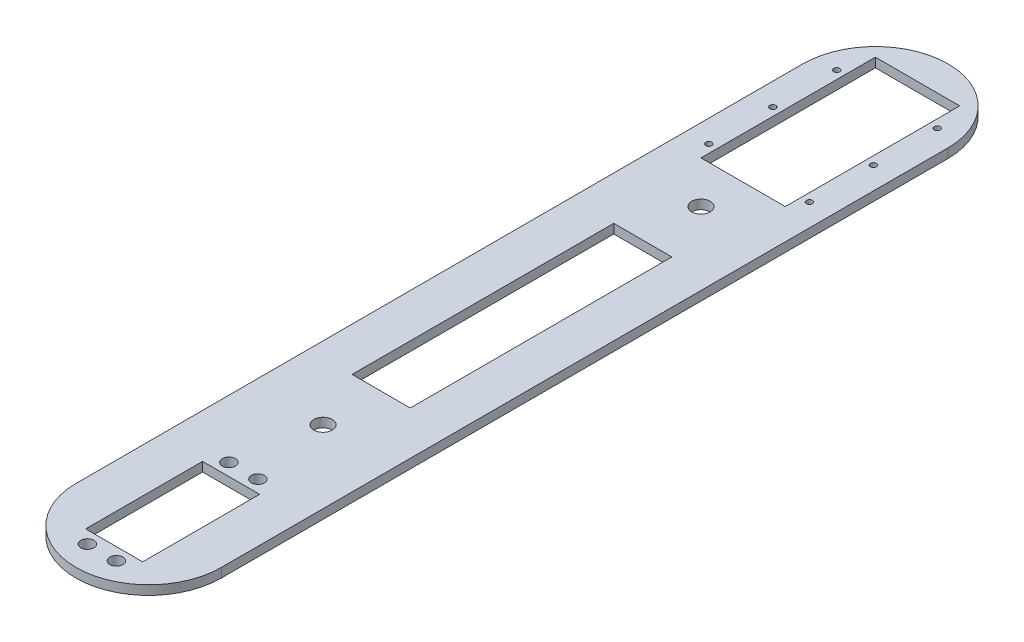
ISO-10303-21;
HEADER;
FILE_DESCRIPTION(('STEP AP214'),'2;1');
FILE_NAME('part.step','',(''),(''),'','','');
FILE_SCHEMA(('AUTOMOTIVE_DESIGN { 1 0 10303 214 1 1 1 1 }'));
ENDSEC;
DATA;
#1=APPLICATION_CONTEXT('core data for automotive mechanical design processes');
#2=APPLICATION_PROTOCOL_DEFINITION('international standard','automotive_design',2000,#1);
#3=PRODUCT_CONTEXT('',#1,'mechanical');
#4=PRODUCT('Part','Part','',(#3));
#5=PRODUCT_RELATED_PRODUCT_CATEGORY('part','',(#4));
#6=PRODUCT_DEFINITION_FORMATION('','',#4);
#7=PRODUCT_DEFINITION_CONTEXT('part definition',#1,'design');
#8=PRODUCT_DEFINITION('design','',#6,#7);
#9=PRODUCT_DEFINITION_SHAPE('','',#8);
#10=(LENGTH_UNIT() NAMED_UNIT(*) SI_UNIT(.MILLI.,.METRE.));
#11=(NAMED_UNIT(*) PLANE_ANGLE_UNIT() SI_UNIT($,.RADIAN.));
#12=(NAMED_UNIT(*) SI_UNIT($,.STERADIAN.) SOLID_ANGLE_UNIT());
#13=UNCERTAINTY_MEASURE_WITH_UNIT(LENGTH_MEASURE(1.E-05),#10,'distance_accuracy_value','');
#14=(GEOMETRIC_REPRESENTATION_CONTEXT(3) GLOBAL_UNCERTAINTY_ASSIGNED_CONTEXT((#13)) GLOBAL_UNIT_ASSIGNED_CONTEXT((#10,
#11,#12)) REPRESENTATION_CONTEXT('',''));
#15=CARTESIAN_POINT('',(0.,0.,0.));
#16=DIRECTION('',(0.,0.,1.));
#17=DIRECTION('',(1.,0.,0.));
#18=AXIS2_PLACEMENT_3D('',#15,#16,#17);
#19=CARTESIAN_POINT('',(0.,3.175,0.));
#20=DIRECTION('',(0.,1.,0.));
#21=DIRECTION('',(0.,0.,1.));
#22=AXIS2_PLACEMENT_3D('',#19,#20,#21);
#23=PLANE('',#22);
#24=CARTESIAN_POINT('',(25.,3.175,85.));
#25=DIRECTION('',(0.,1.,0.));
#26=DIRECTION('',(0.,0.,1.));
#27=AXIS2_PLACEMENT_3D('',#24,#25,#26);
#28=CIRCLE('',#27,3.175);
#29=CARTESIAN_POINT('',(25.,3.175,88.175));
#30=VERTEX_POINT('',#29);
#31=EDGE_CURVE('E513',#30,#30,#28,.T.);
#32=ORIENTED_EDGE('',*,*,#31,.F.);
#33=EDGE_LOOP('',(#32));
#34=FACE_BOUND('',#33,.T.);
#35=CARTESIAN_POINT('',(25.,3.175,215.));
#36=DIRECTION('',(0.,1.,0.));
#37=DIRECTION('',(0.,0.,1.));
#38=AXIS2_PLACEMENT_3D('',#35,#36,#37);
#39=CIRCLE('',#38,3.175);
#40=CARTESIAN_POINT('',(25.,3.175,218.175));
#41=VERTEX_POINT('',#40);
#42=EDGE_CURVE('E523',#41,#41,#39,.T.);
#43=ORIENTED_EDGE('',*,*,#42,.F.);
#44=EDGE_LOOP('',(#43));
#45=FACE_BOUND('',#44,.T.);
#46=DIRECTION('',(0.,0.,1.));
#47=VECTOR('',#46,1.);
#48=CARTESIAN_POINT('',(15.0000000000002,3.175,0.));
#49=LINE('',#48,#47);
#50=CARTESIAN_POINT('',(15.0000000000001,3.175,105.));
#51=VERTEX_POINT('',#50);
#52=CARTESIAN_POINT('',(15.,3.175,195.));
#53=VERTEX_POINT('',#52);
#54=EDGE_CURVE('E215',#51,#53,#49,.T.);
#55=ORIENTED_EDGE('',*,*,#54,.F.);
#56=DIRECTION('',(-1.,0.,0.));
#57=VECTOR('',#56,1.);
#58=CARTESIAN_POINT('',(0.,3.175,105.));
#59=LINE('',#58,#57);
#60=CARTESIAN_POINT('',(35.,3.175,105.));
#61=VERTEX_POINT('',#60);
#62=EDGE_CURVE('E208',#61,#51,#59,.T.);
#63=ORIENTED_EDGE('',*,*,#62,.F.);
#64=DIRECTION('',(0.,0.,-1.));
#65=VECTOR('',#64,1.);
#66=CARTESIAN_POINT('',(35.,3.175,0.));
#67=LINE('',#66,#65);
#68=CARTESIAN_POINT('',(35.,3.175,195.));
#69=VERTEX_POINT('',#68);
#70=EDGE_CURVE('E188',#69,#61,#67,.T.);
#71=ORIENTED_EDGE('',*,*,#70,.F.);
#72=DIRECTION('',(1.,0.,0.));
#73=VECTOR('',#72,1.);
#74=CARTESIAN_POINT('',(0.,3.175,195.));
#75=LINE('',#74,#73);
#76=EDGE_CURVE('E213',#53,#69,#75,.T.);
#77=ORIENTED_EDGE('',*,*,#76,.F.);
#78=EDGE_LOOP('',(#55,#63,#71,#77));
#79=FACE_BOUND('',#78,.T.);
#80=CARTESIAN_POINT('',(30.,3.175,242.39));
#81=DIRECTION('',(0.,1.,0.));
#82=DIRECTION('',(0.,0.,1.));
#83=AXIS2_PLACEMENT_3D('',#80,#81,#82);
#84=CIRCLE('',#83,2.25);
#85=CARTESIAN_POINT('',(30.,3.175,244.64));
#86=VERTEX_POINT('',#85);
#87=EDGE_CURVE('E232',#86,#86,#84,.T.);
#88=ORIENTED_EDGE('',*,*,#87,.F.);
#89=EDGE_LOOP('',(#88));
#90=FACE_BOUND('',#89,.T.);
#91=CARTESIAN_POINT('',(20.,3.175,242.39));
#92=DIRECTION('',(0.,1.,0.));
#93=DIRECTION('',(0.,0.,-1.));
#94=AXIS2_PLACEMENT_3D('',#91,#92,#93);
#95=CIRCLE('',#94,2.25);
#96=CARTESIAN_POINT('',(20.,3.175,240.14));
#97=VERTEX_POINT('',#96);
#98=EDGE_CURVE('E236',#97,#97,#95,.T.);
#99=ORIENTED_EDGE('',*,*,#98,.F.);
#100=EDGE_LOOP('',(#99));
#101=FACE_BOUND('',#100,.T.);
#102=CARTESIAN_POINT('',(30.,3.175,291.07));
#103=DIRECTION('',(0.,1.,0.));
#104=DIRECTION('',(0.,0.,-1.));
#105=AXIS2_PLACEMENT_3D('',#102,#103,#104);
#106=CIRCLE('',#105,2.25);
#107=CARTESIAN_POINT('',(30.,3.175,288.82));
#108=VERTEX_POINT('',#107);
#109=EDGE_CURVE('E240',#108,#108,#106,.T.);
#110=ORIENTED_EDGE('',*,*,#109,.F.);
#111=EDGE_LOOP('',(#110));
#112=FACE_BOUND('',#111,.T.);
#113=CARTESIAN_POINT('',(20.,3.175,291.07));
#114=DIRECTION('',(0.,1.,0.));
#115=DIRECTION('',(0.,0.,1.));
#116=AXIS2_PLACEMENT_3D('',#113,#114,#115);
#117=CIRCLE('',#116,2.25);
#118=CARTESIAN_POINT('',(20.,3.175,293.32));
#119=VERTEX_POINT('',#118);
#120=EDGE_CURVE('E244',#119,#119,#117,.T.);
#121=ORIENTED_EDGE('',*,*,#120,.F.);
#122=EDGE_LOOP('',(#121));
#123=FACE_BOUND('',#122,.T.);
#124=CARTESIAN_POINT('',(42.3,3.175,21.));
#125=DIRECTION('',(0.,1.,0.));
#126=DIRECTION('',(0.,0.,-1.));
#127=AXIS2_PLACEMENT_3D('',#124,#125,#126);
#128=CIRCLE('',#127,1.025);
#129=CARTESIAN_POINT('',(42.3,3.175,19.975));
#130=VERTEX_POINT('',#129);
#131=EDGE_CURVE('E248',#130,#130,#128,.T.);
#132=ORIENTED_EDGE('',*,*,#131,.F.);
#133=EDGE_LOOP('',(#132));
#134=FACE_BOUND('',#133,.T.);
#135=CARTESIAN_POINT('',(42.3,3.175,43.));
#136=DIRECTION('',(0.,1.,0.));
#137=DIRECTION('',(0.,0.,-1.));
#138=AXIS2_PLACEMENT_3D('',#135,#136,#137);
#139=CIRCLE('',#138,1.025);
#140=CARTESIAN_POINT('',(42.3,3.175,41.975));
#141=VERTEX_POINT('',#140);
#142=EDGE_CURVE('E252',#141,#141,#139,.T.);
#143=ORIENTED_EDGE('',*,*,#142,.F.);
#144=EDGE_LOOP('',(#143));
#145=FACE_BOUND('',#144,.T.);
#146=CARTESIAN_POINT('',(42.3,3.175,65.));
#147=DIRECTION('',(0.,1.,0.));
#148=DIRECTION('',(0.,0.,-1.));
#149=AXIS2_PLACEMENT_3D('',#146,#147,#148);
#150=CIRCLE('',#149,1.025);
#151=CARTESIAN_POINT('',(42.3,3.175,63.975));
#152=VERTEX_POINT('',#151);
#153=EDGE_CURVE('E256',#152,#152,#150,.T.);
#154=ORIENTED_EDGE('',*,*,#153,.F.);
#155=EDGE_LOOP('',(#154));
#156=FACE_BOUND('',#155,.T.);
#157=CARTESIAN_POINT('',(7.69999999999999,3.175,65.));
#158=DIRECTION('',(0.,1.,0.));
#159=DIRECTION('',(0.,0.,1.));
#160=AXIS2_PLACEMENT_3D('',#157,#158,#159);
#161=CIRCLE('',#160,1.025);
#162=CARTESIAN_POINT('',(7.69999999999999,3.175,66.025));
#163=VERTEX_POINT('',#162);
#164=EDGE_CURVE('E260',#163,#163,#161,.T.);
#165=ORIENTED_EDGE('',*,*,#164,.F.);
#166=EDGE_LOOP('',(#165));
#167=FACE_BOUND('',#166,.T.);
#168=CARTESIAN_POINT('',(7.69999999999999,3.175,43.));
#169=DIRECTION('',(0.,1.,0.));
#170=DIRECTION('',(0.,0.,1.));
#171=AXIS2_PLACEMENT_3D('',#168,#169,#170);
#172=CIRCLE('',#171,1.025);
#173=CARTESIAN_POINT('',(7.69999999999999,3.175,44.025));
#174=VERTEX_POINT('',#173);
#175=EDGE_CURVE('E264',#174,#174,#172,.T.);
#176=ORIENTED_EDGE('',*,*,#175,.F.);
#177=EDGE_LOOP('',(#176));
#178=FACE_BOUND('',#177,.T.);
#179=CARTESIAN_POINT('',(7.69999999999999,3.175,21.));
#180=DIRECTION('',(0.,1.,0.));
#181=DIRECTION('',(0.,0.,1.));
#182=AXIS2_PLACEMENT_3D('',#179,#180,#181);
#183=CIRCLE('',#182,1.025);
#184=CARTESIAN_POINT('',(7.69999999999999,3.175,22.025));
#185=VERTEX_POINT('',#184);
#186=EDGE_CURVE('E268',#185,#185,#183,.T.);
#187=ORIENTED_EDGE('',*,*,#186,.F.);
#188=EDGE_LOOP('',(#187));
#189=FACE_BOUND('',#188,.T.);
#190=DIRECTION('',(0.,0.,1.));
#191=VECTOR('',#190,1.);
#192=CARTESIAN_POINT('',(15.19,3.175,246.62));
#193=LINE('',#192,#191);
#194=CARTESIAN_POINT('',(15.19,3.175,246.62));
#195=VERTEX_POINT('',#194);
#196=CARTESIAN_POINT('',(15.19,3.175,286.84));
#197=VERTEX_POINT('',#196);
#198=EDGE_CURVE('E272',#195,#197,#193,.T.);
#199=ORIENTED_EDGE('',*,*,#198,.F.);
#200=DIRECTION('',(-1.,0.,0.));
#201=VECTOR('',#200,1.);
#202=CARTESIAN_POINT('',(15.19,3.175,246.62));
#203=LINE('',#202,#201);
#204=CARTESIAN_POINT('',(34.81,3.175,246.62));
#205=VERTEX_POINT('',#204);
#206=EDGE_CURVE('E280',#205,#195,#203,.T.);
#207=ORIENTED_EDGE('',*,*,#206,.F.);
#208=DIRECTION('',(0.,0.,-1.));
#209=VECTOR('',#208,1.);
#210=CARTESIAN_POINT('',(34.81,3.175,246.62));
#211=LINE('',#210,#209);
#212=CARTESIAN_POINT('',(34.81,3.175,286.84));
#213=VERTEX_POINT('',#212);
#214=EDGE_CURVE('E277',#213,#205,#211,.T.);
#215=ORIENTED_EDGE('',*,*,#214,.F.);
#216=DIRECTION('',(1.,0.,0.));
#217=VECTOR('',#216,1.);
#218=CARTESIAN_POINT('',(15.19,3.175,286.84));
#219=LINE('',#218,#217);
#220=EDGE_CURVE('E274',#197,#213,#219,.T.);
#221=ORIENTED_EDGE('',*,*,#220,.F.);
#222=EDGE_LOOP('',(#199,#207,#215,#221));
#223=FACE_BOUND('',#222,.T.);
#224=DIRECTION('',(0.,0.,1.));
#225=VECTOR('',#224,1.);
#226=CARTESIAN_POINT('',(10.5,3.175,10.5));
#227=LINE('',#226,#225);
#228=CARTESIAN_POINT('',(10.5,3.175,10.5));
#229=VERTEX_POINT('',#228);
#230=CARTESIAN_POINT('',(10.5,3.175,70.5));
#231=VERTEX_POINT('',#230);
#232=EDGE_CURVE('E286',#229,#231,#227,.T.);
#233=ORIENTED_EDGE('',*,*,#232,.F.);
#234=DIRECTION('',(-1.,0.,0.));
#235=VECTOR('',#234,1.);
#236=CARTESIAN_POINT('',(10.5,3.175,10.5));
#237=LINE('',#236,#235);
#238=CARTESIAN_POINT('',(39.5,3.175,10.5));
#239=VERTEX_POINT('',#238);
#240=EDGE_CURVE('E300',#239,#229,#237,.T.);
#241=ORIENTED_EDGE('',*,*,#240,.F.);
#242=DIRECTION('',(0.,0.,-1.));
#243=VECTOR('',#242,1.);
#244=CARTESIAN_POINT('',(39.5,3.175,10.5));
#245=LINE('',#244,#243);
#246=CARTESIAN_POINT('',(39.5,3.175,70.5));
#247=VERTEX_POINT('',#246);
#248=EDGE_CURVE('E297',#247,#239,#245,.T.);
#249=ORIENTED_EDGE('',*,*,#248,.F.);
#250=DIRECTION('',(1.,0.,0.));
#251=VECTOR('',#250,1.);
#252=CARTESIAN_POINT('',(10.5,3.175,70.5));
#253=LINE('',#252,#251);
#254=EDGE_CURVE('E294',#231,#247,#253,.T.);
#255=ORIENTED_EDGE('',*,*,#254,.F.);
#256=EDGE_LOOP('',(#233,#241,#249,#255));
#257=FACE_BOUND('',#256,.T.);
#258=CARTESIAN_POINT('',(25.,3.175,275.));
#259=DIRECTION('',(0.,1.,0.));
#260=DIRECTION('',(0.,0.,1.));
#261=AXIS2_PLACEMENT_3D('',#258,#259,#260);
#262=CIRCLE('',#261,25.);
#263=CARTESIAN_POINT('',(0.,3.175,275.));
#264=VERTEX_POINT('',#263);
#265=CARTESIAN_POINT('',(50.,3.175,275.));
#266=VERTEX_POINT('',#265);
#267=EDGE_CURVE('E217',#264,#266,#262,.T.);
#268=ORIENTED_EDGE('',*,*,#267,.T.);
#269=DIRECTION('',(0.,0.,-1.));
#270=VECTOR('',#269,1.);
#271=CARTESIAN_POINT('',(50.,3.175,0.));
#272=LINE('',#271,#270);
#273=CARTESIAN_POINT('',(50.,3.175,25.));
#274=VERTEX_POINT('',#273);
#275=EDGE_CURVE('E316',#266,#274,#272,.T.);
#276=ORIENTED_EDGE('',*,*,#275,.T.);
#277=CARTESIAN_POINT('',(25.,3.175,25.));
#278=DIRECTION('',(0.,1.,0.));
#279=DIRECTION('',(0.,0.,1.));
#280=AXIS2_PLACEMENT_3D('',#277,#278,#279);
#281=CIRCLE('',#280,25.);
#282=CARTESIAN_POINT('',(0.,3.175,25.));
#283=VERTEX_POINT('',#282);
#284=EDGE_CURVE('E227',#274,#283,#281,.T.);
#285=ORIENTED_EDGE('',*,*,#284,.T.);
#286=DIRECTION('',(0.,0.,1.));
#287=VECTOR('',#286,1.);
#288=CARTESIAN_POINT('',(0.,3.175,0.));
#289=LINE('',#288,#287);
#290=EDGE_CURVE('E313',#283,#264,#289,.T.);
#291=ORIENTED_EDGE('',*,*,#290,.T.);
#292=EDGE_LOOP('',(#268,#276,#285,#291));
#293=FACE_BOUND('',#292,.T.);
#294=ADVANCED_FACE('F69',(#34,#45,#79,#90,#101,#112,#123,#134,#145,#156,#167,#178,#189,#223,
#257,#293),#23,.T.);
#295=CARTESIAN_POINT('',(0.,0.,0.));
#296=DIRECTION('',(0.,1.,0.));
#297=DIRECTION('',(0.,0.,1.));
#298=AXIS2_PLACEMENT_3D('',#295,#296,#297);
#299=PLANE('',#298);
#300=CARTESIAN_POINT('',(25.,0.,85.));
#301=DIRECTION('',(0.,-1.,0.));
#302=DIRECTION('',(0.,0.,1.));
#303=AXIS2_PLACEMENT_3D('',#300,#301,#302);
#304=CIRCLE('',#303,3.175);
#305=CARTESIAN_POINT('',(25.,0.,88.175));
#306=VERTEX_POINT('',#305);
#307=EDGE_CURVE('E516',#306,#306,#304,.T.);
#308=ORIENTED_EDGE('',*,*,#307,.F.);
#309=EDGE_LOOP('',(#308));
#310=FACE_BOUND('',#309,.T.);
#311=CARTESIAN_POINT('',(25.,0.,215.));
#312=DIRECTION('',(0.,-1.,0.));
#313=DIRECTION('',(0.,0.,-1.));
#314=AXIS2_PLACEMENT_3D('',#311,#312,#313);
#315=CIRCLE('',#314,3.175);
#316=CARTESIAN_POINT('',(25.,0.,211.825));
#317=VERTEX_POINT('',#316);
#318=EDGE_CURVE('E518',#317,#317,#315,.T.);
#319=ORIENTED_EDGE('',*,*,#318,.F.);
#320=EDGE_LOOP('',(#319));
#321=FACE_BOUND('',#320,.T.);
#322=DIRECTION('',(1.,0.,0.));
#323=VECTOR('',#322,1.);
#324=CARTESIAN_POINT('',(15.0000000000001,0.,105.));
#325=LINE('',#324,#323);
#326=CARTESIAN_POINT('',(15.0000000000001,0.,105.));
#327=VERTEX_POINT('',#326);
#328=CARTESIAN_POINT('',(35.,0.,105.));
#329=VERTEX_POINT('',#328);
#330=EDGE_CURVE('E194',#327,#329,#325,.T.);
#331=ORIENTED_EDGE('',*,*,#330,.F.);
#332=DIRECTION('',(0.,0.,-1.));
#333=VECTOR('',#332,1.);
#334=CARTESIAN_POINT('',(15.,0.,195.));
#335=LINE('',#334,#333);
#336=CARTESIAN_POINT('',(15.,0.,195.));
#337=VERTEX_POINT('',#336);
#338=EDGE_CURVE('E92',#337,#327,#335,.T.);
#339=ORIENTED_EDGE('',*,*,#338,.F.);
#340=DIRECTION('',(-1.,0.,0.));
#341=VECTOR('',#340,1.);
#342=CARTESIAN_POINT('',(15.,0.,195.));
#343=LINE('',#342,#341);
#344=CARTESIAN_POINT('',(35.,0.,195.));
#345=VERTEX_POINT('',#344);
#346=EDGE_CURVE('E201',#345,#337,#343,.T.);
#347=ORIENTED_EDGE('',*,*,#346,.F.);
#348=DIRECTION('',(0.,0.,1.));
#349=VECTOR('',#348,1.);
#350=CARTESIAN_POINT('',(35.,0.,195.));
#351=LINE('',#350,#349);
#352=EDGE_CURVE('E185',#329,#345,#351,.T.);
#353=ORIENTED_EDGE('',*,*,#352,.F.);
#354=EDGE_LOOP('',(#331,#339,#347,#353));
#355=FACE_BOUND('',#354,.T.);
#356=CARTESIAN_POINT('',(30.,0.,242.39));
#357=DIRECTION('',(0.,1.,0.));
#358=DIRECTION('',(0.,0.,1.));
#359=AXIS2_PLACEMENT_3D('',#356,#357,#358);
#360=CIRCLE('',#359,2.25);
#361=CARTESIAN_POINT('',(30.,0.,244.64));
#362=VERTEX_POINT('',#361);
#363=EDGE_CURVE('E235',#362,#362,#360,.T.);
#364=ORIENTED_EDGE('',*,*,#363,.T.);
#365=EDGE_LOOP('',(#364));
#366=FACE_BOUND('',#365,.T.);
#367=CARTESIAN_POINT('',(20.,0.,242.39));
#368=DIRECTION('',(0.,1.,0.));
#369=DIRECTION('',(0.,0.,1.));
#370=AXIS2_PLACEMENT_3D('',#367,#368,#369);
#371=CIRCLE('',#370,2.25);
#372=CARTESIAN_POINT('',(20.,0.,244.64));
#373=VERTEX_POINT('',#372);
#374=EDGE_CURVE('E239',#373,#373,#371,.T.);
#375=ORIENTED_EDGE('',*,*,#374,.T.);
#376=EDGE_LOOP('',(#375));
#377=FACE_BOUND('',#376,.T.);
#378=CARTESIAN_POINT('',(30.,0.,291.07));
#379=DIRECTION('',(0.,1.,0.));
#380=DIRECTION('',(0.,0.,1.));
#381=AXIS2_PLACEMENT_3D('',#378,#379,#380);
#382=CIRCLE('',#381,2.25);
#383=CARTESIAN_POINT('',(30.,0.,293.32));
#384=VERTEX_POINT('',#383);
#385=EDGE_CURVE('E243',#384,#384,#382,.T.);
#386=ORIENTED_EDGE('',*,*,#385,.T.);
#387=EDGE_LOOP('',(#386));
#388=FACE_BOUND('',#387,.T.);
#389=CARTESIAN_POINT('',(20.,0.,291.07));
#390=DIRECTION('',(0.,1.,0.));
#391=DIRECTION('',(0.,0.,1.));
#392=AXIS2_PLACEMENT_3D('',#389,#390,#391);
#393=CIRCLE('',#392,2.25);
#394=CARTESIAN_POINT('',(20.,0.,293.32));
#395=VERTEX_POINT('',#394);
#396=EDGE_CURVE('E247',#395,#395,#393,.T.);
#397=ORIENTED_EDGE('',*,*,#396,.T.);
#398=EDGE_LOOP('',(#397));
#399=FACE_BOUND('',#398,.T.);
#400=CARTESIAN_POINT('',(42.3,0.,21.));
#401=DIRECTION('',(0.,1.,0.));
#402=DIRECTION('',(0.,0.,1.));
#403=AXIS2_PLACEMENT_3D('',#400,#401,#402);
#404=CIRCLE('',#403,1.025);
#405=CARTESIAN_POINT('',(42.3,0.,22.025));
#406=VERTEX_POINT('',#405);
#407=EDGE_CURVE('E251',#406,#406,#404,.T.);
#408=ORIENTED_EDGE('',*,*,#407,.T.);
#409=EDGE_LOOP('',(#408));
#410=FACE_BOUND('',#409,.T.);
#411=CARTESIAN_POINT('',(42.3,0.,43.));
#412=DIRECTION('',(0.,1.,0.));
#413=DIRECTION('',(0.,0.,1.));
#414=AXIS2_PLACEMENT_3D('',#411,#412,#413);
#415=CIRCLE('',#414,1.025);
#416=CARTESIAN_POINT('',(42.3,0.,44.025));
#417=VERTEX_POINT('',#416);
#418=EDGE_CURVE('E255',#417,#417,#415,.T.);
#419=ORIENTED_EDGE('',*,*,#418,.T.);
#420=EDGE_LOOP('',(#419));
#421=FACE_BOUND('',#420,.T.);
#422=CARTESIAN_POINT('',(42.3,0.,65.));
#423=DIRECTION('',(0.,1.,0.));
#424=DIRECTION('',(0.,0.,1.));
#425=AXIS2_PLACEMENT_3D('',#422,#423,#424);
#426=CIRCLE('',#425,1.025);
#427=CARTESIAN_POINT('',(42.3,0.,66.025));
#428=VERTEX_POINT('',#427);
#429=EDGE_CURVE('E259',#428,#428,#426,.T.);
#430=ORIENTED_EDGE('',*,*,#429,.T.);
#431=EDGE_LOOP('',(#430));
#432=FACE_BOUND('',#431,.T.);
#433=CARTESIAN_POINT('',(7.69999999999999,0.,65.));
#434=DIRECTION('',(0.,1.,0.));
#435=DIRECTION('',(0.,0.,1.));
#436=AXIS2_PLACEMENT_3D('',#433,#434,#435);
#437=CIRCLE('',#436,1.025);
#438=CARTESIAN_POINT('',(7.69999999999999,0.,66.025));
#439=VERTEX_POINT('',#438);
#440=EDGE_CURVE('E263',#439,#439,#437,.T.);
#441=ORIENTED_EDGE('',*,*,#440,.T.);
#442=EDGE_LOOP('',(#441));
#443=FACE_BOUND('',#442,.T.);
#444=CARTESIAN_POINT('',(7.69999999999999,0.,43.));
#445=DIRECTION('',(0.,1.,0.));
#446=DIRECTION('',(0.,0.,1.));
#447=AXIS2_PLACEMENT_3D('',#444,#445,#446);
#448=CIRCLE('',#447,1.025);
#449=CARTESIAN_POINT('',(7.69999999999999,0.,44.025));
#450=VERTEX_POINT('',#449);
#451=EDGE_CURVE('E267',#450,#450,#448,.T.);
#452=ORIENTED_EDGE('',*,*,#451,.T.);
#453=EDGE_LOOP('',(#452));
#454=FACE_BOUND('',#453,.T.);
#455=CARTESIAN_POINT('',(7.69999999999999,0.,21.));
#456=DIRECTION('',(0.,1.,0.));
#457=DIRECTION('',(0.,0.,1.));
#458=AXIS2_PLACEMENT_3D('',#455,#456,#457);
#459=CIRCLE('',#458,1.025);
#460=CARTESIAN_POINT('',(7.69999999999999,0.,22.025));
#461=VERTEX_POINT('',#460);
#462=EDGE_CURVE('E271',#461,#461,#459,.T.);
#463=ORIENTED_EDGE('',*,*,#462,.T.);
#464=EDGE_LOOP('',(#463));
#465=FACE_BOUND('',#464,.T.);
#466=DIRECTION('',(-1.,0.,0.));
#467=VECTOR('',#466,1.);
#468=CARTESIAN_POINT('',(0.,0.,246.62));
#469=LINE('',#468,#467);
#470=CARTESIAN_POINT('',(34.81,0.,246.62));
#471=VERTEX_POINT('',#470);
#472=CARTESIAN_POINT('',(15.19,0.,246.62));
#473=VERTEX_POINT('',#472);
#474=EDGE_CURVE('E340',#471,#473,#469,.T.);
#475=ORIENTED_EDGE('',*,*,#474,.T.);
#476=DIRECTION('',(0.,0.,1.));
#477=VECTOR('',#476,1.);
#478=CARTESIAN_POINT('',(15.19,0.,0.));
#479=LINE('',#478,#477);
#480=CARTESIAN_POINT('',(15.19,0.,286.84));
#481=VERTEX_POINT('',#480);
#482=EDGE_CURVE('E343',#473,#481,#479,.T.);
#483=ORIENTED_EDGE('',*,*,#482,.T.);
#484=DIRECTION('',(1.,0.,0.));
#485=VECTOR('',#484,1.);
#486=CARTESIAN_POINT('',(0.,0.,286.84));
#487=LINE('',#486,#485);
#488=CARTESIAN_POINT('',(34.81,0.,286.84));
#489=VERTEX_POINT('',#488);
#490=EDGE_CURVE('E334',#481,#489,#487,.T.);
#491=ORIENTED_EDGE('',*,*,#490,.T.);
#492=DIRECTION('',(0.,0.,-1.));
#493=VECTOR('',#492,1.);
#494=CARTESIAN_POINT('',(34.81,0.,0.));
#495=LINE('',#494,#493);
#496=EDGE_CURVE('E337',#489,#471,#495,.T.);
#497=ORIENTED_EDGE('',*,*,#496,.T.);
#498=EDGE_LOOP('',(#475,#483,#491,#497));
#499=FACE_BOUND('',#498,.T.);
#500=DIRECTION('',(-1.,0.,0.));
#501=VECTOR('',#500,1.);
#502=CARTESIAN_POINT('',(0.,0.,10.5));
#503=LINE('',#502,#501);
#504=CARTESIAN_POINT('',(39.5,0.,10.5));
#505=VERTEX_POINT('',#504);
#506=CARTESIAN_POINT('',(10.5,0.,10.5));
#507=VERTEX_POINT('',#506);
#508=EDGE_CURVE('E328',#505,#507,#503,.T.);
#509=ORIENTED_EDGE('',*,*,#508,.T.);
#510=DIRECTION('',(0.,0.,1.));
#511=VECTOR('',#510,1.);
#512=CARTESIAN_POINT('',(10.5,0.,0.));
#513=LINE('',#512,#511);
#514=CARTESIAN_POINT('',(10.5,0.,70.5));
#515=VERTEX_POINT('',#514);
#516=EDGE_CURVE('E331',#507,#515,#513,.T.);
#517=ORIENTED_EDGE('',*,*,#516,.T.);
#518=DIRECTION('',(1.,0.,0.));
#519=VECTOR('',#518,1.);
#520=CARTESIAN_POINT('',(0.,0.,70.5));
#521=LINE('',#520,#519);
#522=CARTESIAN_POINT('',(39.5,0.,70.5));
#523=VERTEX_POINT('',#522);
#524=EDGE_CURVE('E319',#515,#523,#521,.T.);
#525=ORIENTED_EDGE('',*,*,#524,.T.);
#526=DIRECTION('',(0.,0.,-1.));
#527=VECTOR('',#526,1.);
#528=CARTESIAN_POINT('',(39.5,0.,0.));
#529=LINE('',#528,#527);
#530=EDGE_CURVE('E325',#523,#505,#529,.T.);
#531=ORIENTED_EDGE('',*,*,#530,.T.);
#532=EDGE_LOOP('',(#509,#517,#525,#531));
#533=FACE_BOUND('',#532,.T.);
#534=DIRECTION('',(0.,0.,-1.));
#535=VECTOR('',#534,1.);
#536=CARTESIAN_POINT('',(50.,0.,0.));
#537=LINE('',#536,#535);
#538=CARTESIAN_POINT('',(50.,0.,275.));
#539=VERTEX_POINT('',#538);
#540=CARTESIAN_POINT('',(50.,0.,25.));
#541=VERTEX_POINT('',#540);
#542=EDGE_CURVE('E317',#539,#541,#537,.T.);
#543=ORIENTED_EDGE('',*,*,#542,.F.);
#544=CARTESIAN_POINT('',(25.,0.,275.));
#545=DIRECTION('',(0.,1.,0.));
#546=DIRECTION('',(0.,0.,1.));
#547=AXIS2_PLACEMENT_3D('',#544,#545,#546);
#548=CIRCLE('',#547,25.);
#549=CARTESIAN_POINT('',(0.,0.,275.));
#550=VERTEX_POINT('',#549);
#551=EDGE_CURVE('E222',#550,#539,#548,.T.);
#552=ORIENTED_EDGE('',*,*,#551,.F.);
#553=DIRECTION('',(0.,0.,1.));
#554=VECTOR('',#553,1.);
#555=CARTESIAN_POINT('',(0.,0.,0.));
#556=LINE('',#555,#554);
#557=CARTESIAN_POINT('',(0.,0.,25.));
#558=VERTEX_POINT('',#557);
#559=EDGE_CURVE('E306',#558,#550,#556,.T.);
#560=ORIENTED_EDGE('',*,*,#559,.F.);
#561=CARTESIAN_POINT('',(25.,0.,25.));
#562=DIRECTION('',(0.,1.,0.));
#563=DIRECTION('',(0.,0.,1.));
#564=AXIS2_PLACEMENT_3D('',#561,#562,#563);
#565=CIRCLE('',#564,25.);
#566=EDGE_CURVE('E77',#541,#558,#565,.T.);
#567=ORIENTED_EDGE('',*,*,#566,.F.);
#568=EDGE_LOOP('',(#543,#552,#560,#567));
#569=FACE_BOUND('',#568,.T.);
#570=ADVANCED_FACE('F198',(#310,#321,#355,#366,#377,#388,#399,#410,#421,#432,#443,#454,#465,
#499,#533,#569),#299,.F.);
#571=CARTESIAN_POINT('',(50.,3.175,0.));
#572=DIRECTION('',(-1.,0.,0.));
#573=DIRECTION('',(0.,0.,1.));
#574=AXIS2_PLACEMENT_3D('',#571,#572,#573);
#575=PLANE('',#574);
#576=DIRECTION('',(0.,1.,0.));
#577=VECTOR('',#576,1.);
#578=CARTESIAN_POINT('',(50.,-3.175,275.));
#579=LINE('',#578,#577);
#580=EDGE_CURVE('E12',#539,#266,#579,.T.);
#581=ORIENTED_EDGE('',*,*,#580,.F.);
#582=ORIENTED_EDGE('',*,*,#542,.T.);
#583=DIRECTION('',(0.,1.,0.));
#584=VECTOR('',#583,1.);
#585=CARTESIAN_POINT('',(50.,-3.175,25.));
#586=LINE('',#585,#584);
#587=EDGE_CURVE('E224',#541,#274,#586,.T.);
#588=ORIENTED_EDGE('',*,*,#587,.T.);
#589=ORIENTED_EDGE('',*,*,#275,.F.);
#590=EDGE_LOOP('',(#581,#582,#588,#589));
#591=FACE_BOUND('',#590,.T.);
#592=ADVANCED_FACE('F382',(#591),#575,.F.);
#593=CARTESIAN_POINT('',(0.,3.175,0.));
#594=DIRECTION('',(1.,0.,0.));
#595=DIRECTION('',(0.,0.,-1.));
#596=AXIS2_PLACEMENT_3D('',#593,#594,#595);
#597=PLANE('',#596);
#598=ORIENTED_EDGE('',*,*,#559,.T.);
#599=DIRECTION('',(0.,1.,0.));
#600=VECTOR('',#599,1.);
#601=CARTESIAN_POINT('',(0.,-3.175,275.));
#602=LINE('',#601,#600);
#603=EDGE_CURVE('E219',#550,#264,#602,.T.);
#604=ORIENTED_EDGE('',*,*,#603,.T.);
#605=ORIENTED_EDGE('',*,*,#290,.F.);
#606=DIRECTION('',(0.,1.,0.));
#607=VECTOR('',#606,1.);
#608=CARTESIAN_POINT('',(0.,-3.175,25.));
#609=LINE('',#608,#607);
#610=EDGE_CURVE('E230',#558,#283,#609,.T.);
#611=ORIENTED_EDGE('',*,*,#610,.F.);
#612=EDGE_LOOP('',(#598,#604,#605,#611));
#613=FACE_BOUND('',#612,.T.);
#614=ADVANCED_FACE('F71',(#613),#597,.F.);
#615=CARTESIAN_POINT('',(10.5,-3.175,10.5));
#616=DIRECTION('',(-1.,0.,0.));
#617=DIRECTION('',(0.,0.,1.));
#618=AXIS2_PLACEMENT_3D('',#615,#616,#617);
#619=PLANE('',#618);
#620=DIRECTION('',(0.,1.,0.));
#621=VECTOR('',#620,1.);
#622=CARTESIAN_POINT('',(10.5,-3.175,10.5));
#623=LINE('',#622,#621);
#624=EDGE_CURVE('E304',#507,#229,#623,.T.);
#625=ORIENTED_EDGE('',*,*,#624,.T.);
#626=ORIENTED_EDGE('',*,*,#232,.T.);
#627=DIRECTION('',(0.,1.,0.));
#628=VECTOR('',#627,1.);
#629=CARTESIAN_POINT('',(10.5,-3.175,70.5));
#630=LINE('',#629,#628);
#631=EDGE_CURVE('E303',#515,#231,#630,.T.);
#632=ORIENTED_EDGE('',*,*,#631,.F.);
#633=ORIENTED_EDGE('',*,*,#516,.F.);
#634=EDGE_LOOP('',(#625,#626,#632,#633));
#635=FACE_BOUND('',#634,.T.);
#636=ADVANCED_FACE('F395',(#635),#619,.F.);
#637=CARTESIAN_POINT('',(10.5,-3.175,10.5));
#638=DIRECTION('',(0.,0.,-1.));
#639=DIRECTION('',(-1.,0.,0.));
#640=AXIS2_PLACEMENT_3D('',#637,#638,#639);
#641=PLANE('',#640);
#642=DIRECTION('',(0.,1.,0.));
#643=VECTOR('',#642,1.);
#644=CARTESIAN_POINT('',(39.5,-3.175,10.5));
#645=LINE('',#644,#643);
#646=EDGE_CURVE('E307',#505,#239,#645,.T.);
#647=ORIENTED_EDGE('',*,*,#646,.T.);
#648=ORIENTED_EDGE('',*,*,#240,.T.);
#649=ORIENTED_EDGE('',*,*,#624,.F.);
#650=ORIENTED_EDGE('',*,*,#508,.F.);
#651=EDGE_LOOP('',(#647,#648,#649,#650));
#652=FACE_BOUND('',#651,.T.);
#653=ADVANCED_FACE('F404',(#652),#641,.F.);
#654=CARTESIAN_POINT('',(39.5,-3.175,10.5));
#655=DIRECTION('',(1.,0.,0.));
#656=DIRECTION('',(0.,0.,-1.));
#657=AXIS2_PLACEMENT_3D('',#654,#655,#656);
#658=PLANE('',#657);
#659=DIRECTION('',(0.,1.,0.));
#660=VECTOR('',#659,1.);
#661=CARTESIAN_POINT('',(39.5,-3.175,70.5));
#662=LINE('',#661,#660);
#663=EDGE_CURVE('E309',#523,#247,#662,.T.);
#664=ORIENTED_EDGE('',*,*,#663,.T.);
#665=ORIENTED_EDGE('',*,*,#248,.T.);
#666=ORIENTED_EDGE('',*,*,#646,.F.);
#667=ORIENTED_EDGE('',*,*,#530,.F.);
#668=EDGE_LOOP('',(#664,#665,#666,#667));
#669=FACE_BOUND('',#668,.T.);
#670=ADVANCED_FACE('F409',(#669),#658,.F.);
#671=CARTESIAN_POINT('',(10.5,-3.175,70.5));
#672=DIRECTION('',(0.,0.,1.));
#673=DIRECTION('',(1.,0.,0.));
#674=AXIS2_PLACEMENT_3D('',#671,#672,#673);
#675=PLANE('',#674);
#676=ORIENTED_EDGE('',*,*,#631,.T.);
#677=ORIENTED_EDGE('',*,*,#254,.T.);
#678=ORIENTED_EDGE('',*,*,#663,.F.);
#679=ORIENTED_EDGE('',*,*,#524,.F.);
#680=EDGE_LOOP('',(#676,#677,#678,#679));
#681=FACE_BOUND('',#680,.T.);
#682=ADVANCED_FACE('F421',(#681),#675,.F.);
#683=CARTESIAN_POINT('',(15.19,-3.175,246.62));
#684=DIRECTION('',(-1.,0.,0.));
#685=DIRECTION('',(0.,0.,1.));
#686=AXIS2_PLACEMENT_3D('',#683,#684,#685);
#687=PLANE('',#686);
#688=DIRECTION('',(0.,1.,0.));
#689=VECTOR('',#688,1.);
#690=CARTESIAN_POINT('',(15.19,-3.175,246.62));
#691=LINE('',#690,#689);
#692=EDGE_CURVE('E284',#473,#195,#691,.T.);
#693=ORIENTED_EDGE('',*,*,#692,.T.);
#694=ORIENTED_EDGE('',*,*,#198,.T.);
#695=DIRECTION('',(0.,1.,0.));
#696=VECTOR('',#695,1.);
#697=CARTESIAN_POINT('',(15.19,-3.175,286.84));
#698=LINE('',#697,#696);
#699=EDGE_CURVE('E283',#481,#197,#698,.T.);
#700=ORIENTED_EDGE('',*,*,#699,.F.);
#701=ORIENTED_EDGE('',*,*,#482,.F.);
#702=EDGE_LOOP('',(#693,#694,#700,#701));
#703=FACE_BOUND('',#702,.T.);
#704=ADVANCED_FACE('F430',(#703),#687,.F.);
#705=CARTESIAN_POINT('',(15.19,-3.175,246.62));
#706=DIRECTION('',(0.,0.,-1.));
#707=DIRECTION('',(-1.,0.,0.));
#708=AXIS2_PLACEMENT_3D('',#705,#706,#707);
#709=PLANE('',#708);
#710=DIRECTION('',(0.,1.,0.));
#711=VECTOR('',#710,1.);
#712=CARTESIAN_POINT('',(34.81,-3.175,246.62));
#713=LINE('',#712,#711);
#714=EDGE_CURVE('E287',#471,#205,#713,.T.);
#715=ORIENTED_EDGE('',*,*,#714,.T.);
#716=ORIENTED_EDGE('',*,*,#206,.T.);
#717=ORIENTED_EDGE('',*,*,#692,.F.);
#718=ORIENTED_EDGE('',*,*,#474,.F.);
#719=EDGE_LOOP('',(#715,#716,#717,#718));
#720=FACE_BOUND('',#719,.T.);
#721=ADVANCED_FACE('F434',(#720),#709,.F.);
#722=CARTESIAN_POINT('',(34.81,-3.175,246.62));
#723=DIRECTION('',(1.,0.,0.));
#724=DIRECTION('',(0.,0.,-1.));
#725=AXIS2_PLACEMENT_3D('',#722,#723,#724);
#726=PLANE('',#725);
#727=DIRECTION('',(0.,1.,0.));
#728=VECTOR('',#727,1.);
#729=CARTESIAN_POINT('',(34.81,-3.175,286.84));
#730=LINE('',#729,#728);
#731=EDGE_CURVE('E289',#489,#213,#730,.T.);
#732=ORIENTED_EDGE('',*,*,#731,.T.);
#733=ORIENTED_EDGE('',*,*,#214,.T.);
#734=ORIENTED_EDGE('',*,*,#714,.F.);
#735=ORIENTED_EDGE('',*,*,#496,.F.);
#736=EDGE_LOOP('',(#732,#733,#734,#735));
#737=FACE_BOUND('',#736,.T.);
#738=ADVANCED_FACE('F440',(#737),#726,.F.);
#739=CARTESIAN_POINT('',(15.19,-3.175,286.84));
#740=DIRECTION('',(0.,0.,1.));
#741=DIRECTION('',(1.,0.,0.));
#742=AXIS2_PLACEMENT_3D('',#739,#740,#741);
#743=PLANE('',#742);
#744=ORIENTED_EDGE('',*,*,#699,.T.);
#745=ORIENTED_EDGE('',*,*,#220,.T.);
#746=ORIENTED_EDGE('',*,*,#731,.F.);
#747=ORIENTED_EDGE('',*,*,#490,.F.);
#748=EDGE_LOOP('',(#744,#745,#746,#747));
#749=FACE_BOUND('',#748,.T.);
#750=ADVANCED_FACE('F436',(#749),#743,.F.);
#751=CARTESIAN_POINT('',(7.69999999999999,-3.175,21.));
#752=DIRECTION('',(0.,1.,0.));
#753=DIRECTION('',(0.,0.,1.));
#754=AXIS2_PLACEMENT_3D('',#751,#752,#753);
#755=CYLINDRICAL_SURFACE('',#754,1.025);
#756=ORIENTED_EDGE('',*,*,#186,.T.);
#757=EDGE_LOOP('',(#756));
#758=FACE_BOUND('',#757,.T.);
#759=ORIENTED_EDGE('',*,*,#462,.F.);
#760=EDGE_LOOP('',(#759));
#761=FACE_BOUND('',#760,.T.);
#762=ADVANCED_FACE('F439',(#758,#761),#755,.F.);
#763=CARTESIAN_POINT('',(7.69999999999999,-3.175,43.));
#764=DIRECTION('',(0.,1.,0.));
#765=DIRECTION('',(0.,0.,1.));
#766=AXIS2_PLACEMENT_3D('',#763,#764,#765);
#767=CYLINDRICAL_SURFACE('',#766,1.025);
#768=ORIENTED_EDGE('',*,*,#175,.T.);
#769=EDGE_LOOP('',(#768));
#770=FACE_BOUND('',#769,.T.);
#771=ORIENTED_EDGE('',*,*,#451,.F.);
#772=EDGE_LOOP('',(#771));
#773=FACE_BOUND('',#772,.T.);
#774=ADVANCED_FACE('F450',(#770,#773),#767,.F.);
#775=CARTESIAN_POINT('',(7.69999999999999,-3.175,65.));
#776=DIRECTION('',(0.,1.,0.));
#777=DIRECTION('',(0.,0.,1.));
#778=AXIS2_PLACEMENT_3D('',#775,#776,#777);
#779=CYLINDRICAL_SURFACE('',#778,1.025);
#780=ORIENTED_EDGE('',*,*,#164,.T.);
#781=EDGE_LOOP('',(#780));
#782=FACE_BOUND('',#781,.T.);
#783=ORIENTED_EDGE('',*,*,#440,.F.);
#784=EDGE_LOOP('',(#783));
#785=FACE_BOUND('',#784,.T.);
#786=ADVANCED_FACE('F454',(#782,#785),#779,.F.);
#787=CARTESIAN_POINT('',(42.3,-3.175,65.));
#788=DIRECTION('',(0.,1.,0.));
#789=DIRECTION('',(0.,0.,1.));
#790=AXIS2_PLACEMENT_3D('',#787,#788,#789);
#791=CYLINDRICAL_SURFACE('',#790,1.025);
#792=ORIENTED_EDGE('',*,*,#153,.T.);
#793=EDGE_LOOP('',(#792));
#794=FACE_BOUND('',#793,.T.);
#795=ORIENTED_EDGE('',*,*,#429,.F.);
#796=EDGE_LOOP('',(#795));
#797=FACE_BOUND('',#796,.T.);
#798=ADVANCED_FACE('F458',(#794,#797),#791,.F.);
#799=CARTESIAN_POINT('',(42.3,-3.175,43.));
#800=DIRECTION('',(0.,1.,0.));
#801=DIRECTION('',(0.,0.,1.));
#802=AXIS2_PLACEMENT_3D('',#799,#800,#801);
#803=CYLINDRICAL_SURFACE('',#802,1.025);
#804=ORIENTED_EDGE('',*,*,#142,.T.);
#805=EDGE_LOOP('',(#804));
#806=FACE_BOUND('',#805,.T.);
#807=ORIENTED_EDGE('',*,*,#418,.F.);
#808=EDGE_LOOP('',(#807));
#809=FACE_BOUND('',#808,.T.);
#810=ADVANCED_FACE('F462',(#806,#809),#803,.F.);
#811=CARTESIAN_POINT('',(42.3,-3.175,21.));
#812=DIRECTION('',(0.,1.,0.));
#813=DIRECTION('',(0.,0.,1.));
#814=AXIS2_PLACEMENT_3D('',#811,#812,#813);
#815=CYLINDRICAL_SURFACE('',#814,1.025);
#816=ORIENTED_EDGE('',*,*,#131,.T.);
#817=EDGE_LOOP('',(#816));
#818=FACE_BOUND('',#817,.T.);
#819=ORIENTED_EDGE('',*,*,#407,.F.);
#820=EDGE_LOOP('',(#819));
#821=FACE_BOUND('',#820,.T.);
#822=ADVANCED_FACE('F466',(#818,#821),#815,.F.);
#823=CARTESIAN_POINT('',(20.,-3.175,291.07));
#824=DIRECTION('',(0.,1.,0.));
#825=DIRECTION('',(0.,0.,1.));
#826=AXIS2_PLACEMENT_3D('',#823,#824,#825);
#827=CYLINDRICAL_SURFACE('',#826,2.25);
#828=ORIENTED_EDGE('',*,*,#120,.T.);
#829=EDGE_LOOP('',(#828));
#830=FACE_BOUND('',#829,.T.);
#831=ORIENTED_EDGE('',*,*,#396,.F.);
#832=EDGE_LOOP('',(#831));
#833=FACE_BOUND('',#832,.T.);
#834=ADVANCED_FACE('F470',(#830,#833),#827,.F.);
#835=CARTESIAN_POINT('',(30.,-3.175,291.07));
#836=DIRECTION('',(0.,1.,0.));
#837=DIRECTION('',(0.,0.,1.));
#838=AXIS2_PLACEMENT_3D('',#835,#836,#837);
#839=CYLINDRICAL_SURFACE('',#838,2.25);
#840=ORIENTED_EDGE('',*,*,#109,.T.);
#841=EDGE_LOOP('',(#840));
#842=FACE_BOUND('',#841,.T.);
#843=ORIENTED_EDGE('',*,*,#385,.F.);
#844=EDGE_LOOP('',(#843));
#845=FACE_BOUND('',#844,.T.);
#846=ADVANCED_FACE('F474',(#842,#845),#839,.F.);
#847=CARTESIAN_POINT('',(20.,-3.175,242.39));
#848=DIRECTION('',(0.,1.,0.));
#849=DIRECTION('',(0.,0.,1.));
#850=AXIS2_PLACEMENT_3D('',#847,#848,#849);
#851=CYLINDRICAL_SURFACE('',#850,2.25);
#852=ORIENTED_EDGE('',*,*,#98,.T.);
#853=EDGE_LOOP('',(#852));
#854=FACE_BOUND('',#853,.T.);
#855=ORIENTED_EDGE('',*,*,#374,.F.);
#856=EDGE_LOOP('',(#855));
#857=FACE_BOUND('',#856,.T.);
#858=ADVANCED_FACE('F478',(#854,#857),#851,.F.);
#859=CARTESIAN_POINT('',(30.,-3.175,242.39));
#860=DIRECTION('',(0.,1.,0.));
#861=DIRECTION('',(0.,0.,1.));
#862=AXIS2_PLACEMENT_3D('',#859,#860,#861);
#863=CYLINDRICAL_SURFACE('',#862,2.25);
#864=ORIENTED_EDGE('',*,*,#87,.T.);
#865=EDGE_LOOP('',(#864));
#866=FACE_BOUND('',#865,.T.);
#867=ORIENTED_EDGE('',*,*,#363,.F.);
#868=EDGE_LOOP('',(#867));
#869=FACE_BOUND('',#868,.T.);
#870=ADVANCED_FACE('F482',(#866,#869),#863,.F.);
#871=CARTESIAN_POINT('',(25.,-3.175,25.));
#872=DIRECTION('',(0.,1.,0.));
#873=DIRECTION('',(0.,0.,1.));
#874=AXIS2_PLACEMENT_3D('',#871,#872,#873);
#875=CYLINDRICAL_SURFACE('',#874,25.);
#876=ORIENTED_EDGE('',*,*,#566,.T.);
#877=ORIENTED_EDGE('',*,*,#610,.T.);
#878=ORIENTED_EDGE('',*,*,#284,.F.);
#879=ORIENTED_EDGE('',*,*,#587,.F.);
#880=EDGE_LOOP('',(#876,#877,#878,#879));
#881=FACE_BOUND('',#880,.T.);
#882=ADVANCED_FACE('F369',(#881),#875,.T.);
#883=CARTESIAN_POINT('',(25.,-3.175,275.));
#884=DIRECTION('',(0.,1.,0.));
#885=DIRECTION('',(0.,0.,1.));
#886=AXIS2_PLACEMENT_3D('',#883,#884,#885);
#887=CYLINDRICAL_SURFACE('',#886,25.);
#888=ORIENTED_EDGE('',*,*,#551,.T.);
#889=ORIENTED_EDGE('',*,*,#580,.T.);
#890=ORIENTED_EDGE('',*,*,#267,.F.);
#891=ORIENTED_EDGE('',*,*,#603,.F.);
#892=EDGE_LOOP('',(#888,#889,#890,#891));
#893=FACE_BOUND('',#892,.T.);
#894=ADVANCED_FACE('F379',(#893),#887,.T.);
#895=CARTESIAN_POINT('',(15.,6.35,195.));
#896=DIRECTION('',(-1.,0.,0.));
#897=DIRECTION('',(0.,0.,1.));
#898=AXIS2_PLACEMENT_3D('',#895,#896,#897);
#899=PLANE('',#898);
#900=ORIENTED_EDGE('',*,*,#54,.T.);
#901=DIRECTION('',(0.,-1.,0.));
#902=VECTOR('',#901,1.);
#903=CARTESIAN_POINT('',(15.,6.35,195.));
#904=LINE('',#903,#902);
#905=EDGE_CURVE('E206',#53,#337,#904,.T.);
#906=ORIENTED_EDGE('',*,*,#905,.T.);
#907=ORIENTED_EDGE('',*,*,#338,.T.);
#908=DIRECTION('',(0.,-1.,0.));
#909=VECTOR('',#908,1.);
#910=CARTESIAN_POINT('',(15.0000000000001,6.35,105.));
#911=LINE('',#910,#909);
#912=EDGE_CURVE('E191',#51,#327,#911,.T.);
#913=ORIENTED_EDGE('',*,*,#912,.F.);
#914=EDGE_LOOP('',(#900,#906,#907,#913));
#915=FACE_BOUND('',#914,.T.);
#916=ADVANCED_FACE('F491',(#915),#899,.F.);
#917=CARTESIAN_POINT('',(15.,6.35,195.));
#918=DIRECTION('',(0.,0.,1.));
#919=DIRECTION('',(1.,0.,0.));
#920=AXIS2_PLACEMENT_3D('',#917,#918,#919);
#921=PLANE('',#920);
#922=ORIENTED_EDGE('',*,*,#76,.T.);
#923=DIRECTION('',(0.,-1.,0.));
#924=VECTOR('',#923,1.);
#925=CARTESIAN_POINT('',(35.,6.35,195.));
#926=LINE('',#925,#924);
#927=EDGE_CURVE('E190',#69,#345,#926,.T.);
#928=ORIENTED_EDGE('',*,*,#927,.T.);
#929=ORIENTED_EDGE('',*,*,#346,.T.);
#930=ORIENTED_EDGE('',*,*,#905,.F.);
#931=EDGE_LOOP('',(#922,#928,#929,#930));
#932=FACE_BOUND('',#931,.T.);
#933=ADVANCED_FACE('F494',(#932),#921,.F.);
#934=CARTESIAN_POINT('',(35.,6.35,195.));
#935=DIRECTION('',(1.,0.,0.));
#936=DIRECTION('',(0.,0.,-1.));
#937=AXIS2_PLACEMENT_3D('',#934,#935,#936);
#938=PLANE('',#937);
#939=ORIENTED_EDGE('',*,*,#70,.T.);
#940=DIRECTION('',(0.,-1.,0.));
#941=VECTOR('',#940,1.);
#942=CARTESIAN_POINT('',(35.,6.35,105.));
#943=LINE('',#942,#941);
#944=EDGE_CURVE('E84',#61,#329,#943,.T.);
#945=ORIENTED_EDGE('',*,*,#944,.T.);
#946=ORIENTED_EDGE('',*,*,#352,.T.);
#947=ORIENTED_EDGE('',*,*,#927,.F.);
#948=EDGE_LOOP('',(#939,#945,#946,#947));
#949=FACE_BOUND('',#948,.T.);
#950=ADVANCED_FACE('F182',(#949),#938,.F.);
#951=CARTESIAN_POINT('',(15.0000000000001,6.35,105.));
#952=DIRECTION('',(0.,0.,-1.));
#953=DIRECTION('',(-1.,0.,0.));
#954=AXIS2_PLACEMENT_3D('',#951,#952,#953);
#955=PLANE('',#954);
#956=ORIENTED_EDGE('',*,*,#62,.T.);
#957=ORIENTED_EDGE('',*,*,#912,.T.);
#958=ORIENTED_EDGE('',*,*,#330,.T.);
#959=ORIENTED_EDGE('',*,*,#944,.F.);
#960=EDGE_LOOP('',(#956,#957,#958,#959));
#961=FACE_BOUND('',#960,.T.);
#962=ADVANCED_FACE('F195',(#961),#955,.F.);
#963=CARTESIAN_POINT('',(25.,6.35,215.));
#964=DIRECTION('',(0.,-1.,0.));
#965=DIRECTION('',(0.,0.,-1.));
#966=AXIS2_PLACEMENT_3D('',#963,#964,#965);
#967=CYLINDRICAL_SURFACE('',#966,3.175);
#968=ORIENTED_EDGE('',*,*,#42,.T.);
#969=EDGE_LOOP('',(#968));
#970=FACE_BOUND('',#969,.T.);
#971=ORIENTED_EDGE('',*,*,#318,.T.);
#972=EDGE_LOOP('',(#971));
#973=FACE_BOUND('',#972,.T.);
#974=ADVANCED_FACE('F497',(#970,#973),#967,.F.);
#975=CARTESIAN_POINT('',(25.,6.35,85.));
#976=DIRECTION('',(0.,-1.,0.));
#977=DIRECTION('',(0.,0.,-1.));
#978=AXIS2_PLACEMENT_3D('',#975,#976,#977);
#979=CYLINDRICAL_SURFACE('',#978,3.175);
#980=ORIENTED_EDGE('',*,*,#31,.T.);
#981=EDGE_LOOP('',(#980));
#982=FACE_BOUND('',#981,.T.);
#983=ORIENTED_EDGE('',*,*,#307,.T.);
#984=EDGE_LOOP('',(#983));
#985=FACE_BOUND('',#984,.T.);
#986=ADVANCED_FACE('F505',(#982,#985),#979,.F.);
#987=CLOSED_SHELL('',(#294,#570,#592,#614,#636,#653,#670,#682,#704,#721,#738,#750,#762,#774,
#786,#798,#810,#822,#834,#846,#858,#870,#882,#894,#916,#933,#950,#962,#974,#986));
#988=MANIFOLD_SOLID_BREP('B2',#987);
#989=ADVANCED_BREP_SHAPE_REPRESENTATION('',(#18,#988),#14);
#990=SHAPE_DEFINITION_REPRESENTATION(#9,#989);
ENDSEC;
END-ISO-10303-21;
